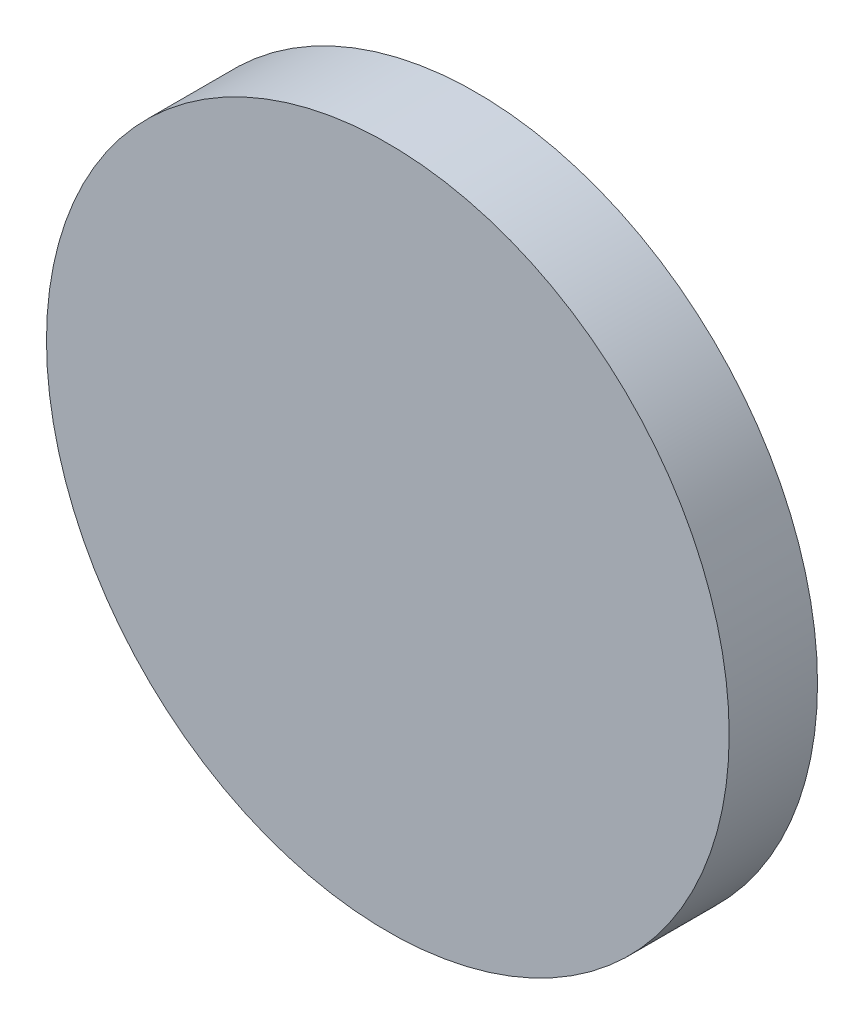
ISO-10303-21;
HEADER;
FILE_DESCRIPTION(('STEP AP214'),'2;1');
FILE_NAME('part.step','',(''),(''),'','','');
FILE_SCHEMA(('AUTOMOTIVE_DESIGN { 1 0 10303 214 1 1 1 1 }'));
ENDSEC;
DATA;
#1=APPLICATION_CONTEXT('core data for automotive mechanical design processes');
#2=APPLICATION_PROTOCOL_DEFINITION('international standard','automotive_design',2000,#1);
#3=PRODUCT_CONTEXT('',#1,'mechanical');
#4=PRODUCT('Part','Part','',(#3));
#5=PRODUCT_RELATED_PRODUCT_CATEGORY('part','',(#4));
#6=PRODUCT_DEFINITION_FORMATION('','',#4);
#7=PRODUCT_DEFINITION_CONTEXT('part definition',#1,'design');
#8=PRODUCT_DEFINITION('design','',#6,#7);
#9=PRODUCT_DEFINITION_SHAPE('','',#8);
#10=(LENGTH_UNIT() NAMED_UNIT(*) SI_UNIT(.MILLI.,.METRE.));
#11=(NAMED_UNIT(*) PLANE_ANGLE_UNIT() SI_UNIT($,.RADIAN.));
#12=(NAMED_UNIT(*) SI_UNIT($,.STERADIAN.) SOLID_ANGLE_UNIT());
#13=UNCERTAINTY_MEASURE_WITH_UNIT(LENGTH_MEASURE(1.E-05),#10,'distance_accuracy_value','');
#14=(GEOMETRIC_REPRESENTATION_CONTEXT(3) GLOBAL_UNCERTAINTY_ASSIGNED_CONTEXT((#13)) GLOBAL_UNIT_ASSIGNED_CONTEXT((#10,
#11,#12)) REPRESENTATION_CONTEXT('',''));
#15=CARTESIAN_POINT('',(0.,0.,0.));
#16=DIRECTION('',(0.,0.,1.));
#17=DIRECTION('',(1.,0.,0.));
#18=AXIS2_PLACEMENT_3D('',#15,#16,#17);
#19=CARTESIAN_POINT('',(0.,0.,20.7));
#20=DIRECTION('',(0.,0.,-1.));
#21=DIRECTION('',(-1.,0.,0.));
#22=AXIS2_PLACEMENT_3D('',#19,#20,#21);
#23=CYLINDRICAL_SURFACE('',#22,80.);
#24=CARTESIAN_POINT('',(0.,0.,20.7));
#25=DIRECTION('',(0.,0.,1.));
#26=DIRECTION('',(1.,0.,0.));
#27=AXIS2_PLACEMENT_3D('',#24,#25,#26);
#28=CIRCLE('',#27,80.);
#29=CARTESIAN_POINT('',(80.,0.,20.7));
#30=VERTEX_POINT('',#29);
#31=EDGE_CURVE('E10',#30,#30,#28,.T.);
#32=ORIENTED_EDGE('',*,*,#31,.F.);
#33=EDGE_LOOP('',(#32));
#34=FACE_BOUND('',#33,.T.);
#35=CARTESIAN_POINT('',(0.,0.,0.));
#36=DIRECTION('',(0.,0.,1.));
#37=DIRECTION('',(1.,0.,0.));
#38=AXIS2_PLACEMENT_3D('',#35,#36,#37);
#39=CIRCLE('',#38,80.);
#40=CARTESIAN_POINT('',(80.,0.,0.));
#41=VERTEX_POINT('',#40);
#42=EDGE_CURVE('E40',#41,#41,#39,.T.);
#43=ORIENTED_EDGE('',*,*,#42,.T.);
#44=EDGE_LOOP('',(#43));
#45=FACE_BOUND('',#44,.T.);
#46=ADVANCED_FACE('F37',(#34,#45),#23,.T.);
#47=CARTESIAN_POINT('',(0.,0.,20.7));
#48=DIRECTION('',(0.,0.,1.));
#49=DIRECTION('',(1.,0.,0.));
#50=AXIS2_PLACEMENT_3D('',#47,#48,#49);
#51=PLANE('',#50);
#52=ORIENTED_EDGE('',*,*,#31,.T.);
#53=EDGE_LOOP('',(#52));
#54=FACE_BOUND('',#53,.T.);
#55=ADVANCED_FACE('F52',(#54),#51,.T.);
#56=CARTESIAN_POINT('',(0.,0.,0.));
#57=DIRECTION('',(0.,0.,1.));
#58=DIRECTION('',(1.,0.,0.));
#59=AXIS2_PLACEMENT_3D('',#56,#57,#58);
#60=PLANE('',#59);
#61=ORIENTED_EDGE('',*,*,#42,.F.);
#62=EDGE_LOOP('',(#61));
#63=FACE_BOUND('',#62,.T.);
#64=ADVANCED_FACE('F50',(#63),#60,.F.);
#65=CLOSED_SHELL('',(#46,#55,#64));
#66=MANIFOLD_SOLID_BREP('B2',#65);
#67=ADVANCED_BREP_SHAPE_REPRESENTATION('',(#18,#66),#14);
#68=SHAPE_DEFINITION_REPRESENTATION(#9,#67);
ENDSEC;
END-ISO-10303-21;
